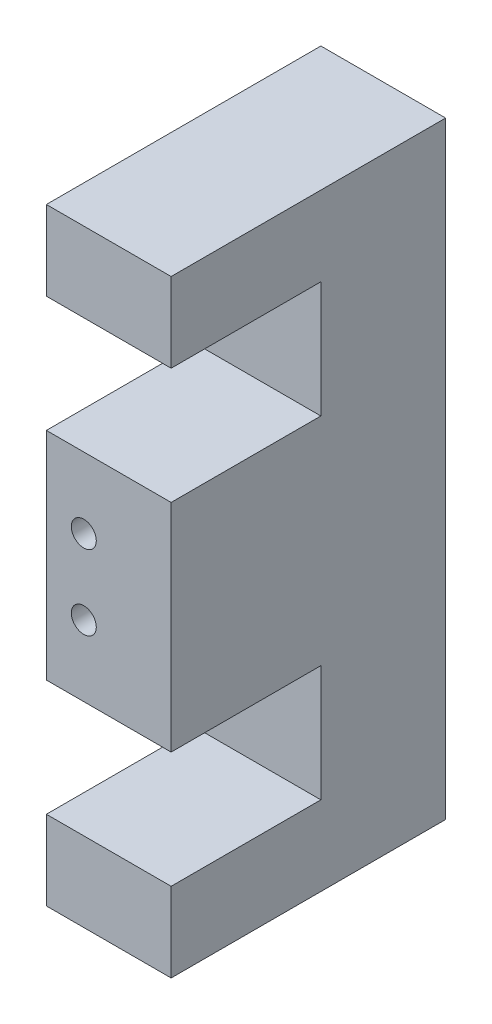
ISO-10303-21;
HEADER;
FILE_DESCRIPTION(('STEP AP214'),'2;1');
FILE_NAME('part.step','',(''),(''),'','','');
FILE_SCHEMA(('AUTOMOTIVE_DESIGN { 1 0 10303 214 1 1 1 1 }'));
ENDSEC;
DATA;
#1=APPLICATION_CONTEXT('core data for automotive mechanical design processes');
#2=APPLICATION_PROTOCOL_DEFINITION('international standard','automotive_design',2000,#1);
#3=PRODUCT_CONTEXT('',#1,'mechanical');
#4=PRODUCT('Part','Part','',(#3));
#5=PRODUCT_RELATED_PRODUCT_CATEGORY('part','',(#4));
#6=PRODUCT_DEFINITION_FORMATION('','',#4);
#7=PRODUCT_DEFINITION_CONTEXT('part definition',#1,'design');
#8=PRODUCT_DEFINITION('design','',#6,#7);
#9=PRODUCT_DEFINITION_SHAPE('','',#8);
#10=(LENGTH_UNIT() NAMED_UNIT(*) SI_UNIT(.MILLI.,.METRE.));
#11=(NAMED_UNIT(*) PLANE_ANGLE_UNIT() SI_UNIT($,.RADIAN.));
#12=(NAMED_UNIT(*) SI_UNIT($,.STERADIAN.) SOLID_ANGLE_UNIT());
#13=UNCERTAINTY_MEASURE_WITH_UNIT(LENGTH_MEASURE(1.E-05),#10,'distance_accuracy_value','');
#14=(GEOMETRIC_REPRESENTATION_CONTEXT(3) GLOBAL_UNCERTAINTY_ASSIGNED_CONTEXT((#13)) GLOBAL_UNIT_ASSIGNED_CONTEXT((#10,
#11,#12)) REPRESENTATION_CONTEXT('',''));
#15=CARTESIAN_POINT('',(0.,0.,0.));
#16=DIRECTION('',(0.,0.,1.));
#17=DIRECTION('',(1.,0.,0.));
#18=AXIS2_PLACEMENT_3D('',#15,#16,#17);
#19=CARTESIAN_POINT('',(0.,0.,-3.99999999999999));
#20=DIRECTION('',(0.,0.,1.));
#21=DIRECTION('',(1.,0.,0.));
#22=AXIS2_PLACEMENT_3D('',#19,#20,#21);
#23=PLANE('',#22);
#24=DIRECTION('',(1.,0.,0.));
#25=VECTOR('',#24,1.);
#26=CARTESIAN_POINT('',(0.,-39.7528650201413,-4.));
#27=LINE('',#26,#25);
#28=CARTESIAN_POINT('',(22.1000000000024,-39.7528650201413,-4.));
#29=VERTEX_POINT('',#28);
#30=CARTESIAN_POINT('',(34.8000000000024,-39.7528650201413,-4.));
#31=VERTEX_POINT('',#30);
#32=EDGE_CURVE('E50',#29,#31,#27,.T.);
#33=ORIENTED_EDGE('',*,*,#32,.T.);
#34=DIRECTION('',(0.,-1.,0.));
#35=VECTOR('',#34,1.);
#36=CARTESIAN_POINT('',(34.8000000000024,0.,-4.));
#37=LINE('',#36,#35);
#38=CARTESIAN_POINT('',(34.8000000000024,-27.923752716534,-4.));
#39=VERTEX_POINT('',#38);
#40=EDGE_CURVE('E216',#39,#31,#37,.T.);
#41=ORIENTED_EDGE('',*,*,#40,.F.);
#42=DIRECTION('',(1.,0.,0.));
#43=VECTOR('',#42,1.);
#44=CARTESIAN_POINT('',(0.,-27.923752716534,-4.));
#45=LINE('',#44,#43);
#46=CARTESIAN_POINT('',(22.1000000000024,-27.923752716534,-4.));
#47=VERTEX_POINT('',#46);
#48=EDGE_CURVE('E165',#47,#39,#45,.T.);
#49=ORIENTED_EDGE('',*,*,#48,.F.);
#50=DIRECTION('',(0.,-1.,0.));
#51=VECTOR('',#50,1.);
#52=CARTESIAN_POINT('',(22.1000000000024,0.,-4.));
#53=LINE('',#52,#51);
#54=EDGE_CURVE('E55',#47,#29,#53,.T.);
#55=ORIENTED_EDGE('',*,*,#54,.T.);
#56=EDGE_LOOP('',(#33,#41,#49,#55));
#57=FACE_BOUND('',#56,.T.);
#58=ADVANCED_FACE('F33',(#57),#23,.T.);
#59=DIRECTION('',(1.,0.,0.));
#60=VECTOR('',#59,1.);
#61=CARTESIAN_POINT('',(0.,-5.91455615180365,-3.99999999999999));
#62=LINE('',#61,#60);
#63=CARTESIAN_POINT('',(22.1000000000024,-5.91455615180365,-4.));
#64=VERTEX_POINT('',#63);
#65=CARTESIAN_POINT('',(34.8000000000024,-5.91455615180365,-4.));
#66=VERTEX_POINT('',#65);
#67=EDGE_CURVE('E159',#64,#66,#62,.T.);
#68=ORIENTED_EDGE('',*,*,#67,.T.);
#69=CARTESIAN_POINT('',(34.8000000000024,5.91455615180364,-4.));
#70=VERTEX_POINT('',#69);
#71=EDGE_CURVE('E208',#70,#66,#37,.T.);
#72=ORIENTED_EDGE('',*,*,#71,.F.);
#73=DIRECTION('',(-1.,0.,0.));
#74=VECTOR('',#73,1.);
#75=CARTESIAN_POINT('',(0.,5.91455615180365,-3.99999999999999));
#76=LINE('',#75,#74);
#77=CARTESIAN_POINT('',(22.1000000000024,5.91455615180364,-4.));
#78=VERTEX_POINT('',#77);
#79=EDGE_CURVE('E179',#70,#78,#76,.T.);
#80=ORIENTED_EDGE('',*,*,#79,.T.);
#81=EDGE_CURVE('E214',#78,#64,#53,.T.);
#82=ORIENTED_EDGE('',*,*,#81,.T.);
#83=EDGE_LOOP('',(#68,#72,#80,#82));
#84=FACE_BOUND('',#83,.T.);
#85=ADVANCED_FACE('F241',(#84),#23,.T.);
#86=CARTESIAN_POINT('',(52.8000000000024,14.,-16.7));
#87=DIRECTION('',(0.,1.,0.));
#88=DIRECTION('',(0.,0.,1.));
#89=AXIS2_PLACEMENT_3D('',#86,#87,#88);
#90=PLANE('',#89);
#91=DIRECTION('',(0.,0.,1.));
#92=VECTOR('',#91,1.);
#93=CARTESIAN_POINT('',(22.1000000000024,14.,-16.7));
#94=LINE('',#93,#92);
#95=CARTESIAN_POINT('',(22.1000000000024,14.,-16.7));
#96=VERTEX_POINT('',#95);
#97=CARTESIAN_POINT('',(22.1000000000024,14.,11.24));
#98=VERTEX_POINT('',#97);
#99=EDGE_CURVE('E37',#96,#98,#94,.T.);
#100=ORIENTED_EDGE('',*,*,#99,.T.);
#101=DIRECTION('',(-1.,0.,0.));
#102=VECTOR('',#101,1.);
#103=CARTESIAN_POINT('',(0.,14.,11.24));
#104=LINE('',#103,#102);
#105=CARTESIAN_POINT('',(34.8000000000024,14.,11.24));
#106=VERTEX_POINT('',#105);
#107=EDGE_CURVE('E196',#106,#98,#104,.T.);
#108=ORIENTED_EDGE('',*,*,#107,.F.);
#109=DIRECTION('',(0.,0.,1.));
#110=VECTOR('',#109,1.);
#111=CARTESIAN_POINT('',(34.8000000000024,14.,-16.7));
#112=LINE('',#111,#110);
#113=CARTESIAN_POINT('',(34.8000000000024,14.,-16.7));
#114=VERTEX_POINT('',#113);
#115=EDGE_CURVE('E11',#114,#106,#112,.T.);
#116=ORIENTED_EDGE('',*,*,#115,.F.);
#117=DIRECTION('',(-1.,0.,0.));
#118=VECTOR('',#117,1.);
#119=CARTESIAN_POINT('',(52.8000000000024,14.,-16.7));
#120=LINE('',#119,#118);
#121=EDGE_CURVE('E205',#114,#96,#120,.T.);
#122=ORIENTED_EDGE('',*,*,#121,.T.);
#123=EDGE_LOOP('',(#100,#108,#116,#122));
#124=FACE_BOUND('',#123,.T.);
#125=ADVANCED_FACE('F35',(#124),#90,.T.);
#126=CARTESIAN_POINT('',(34.8000000000024,0.,-16.7));
#127=DIRECTION('',(-1.,0.,0.));
#128=DIRECTION('',(0.,-1.,0.));
#129=AXIS2_PLACEMENT_3D('',#126,#127,#128);
#130=PLANE('',#129);
#131=ORIENTED_EDGE('',*,*,#115,.T.);
#132=DIRECTION('',(0.,-1.,0.));
#133=VECTOR('',#132,1.);
#134=CARTESIAN_POINT('',(34.8000000000024,0.,11.24));
#135=LINE('',#134,#133);
#136=CARTESIAN_POINT('',(34.8000000000024,5.91455615180364,11.24));
#137=VERTEX_POINT('',#136);
#138=EDGE_CURVE('E188',#106,#137,#135,.T.);
#139=ORIENTED_EDGE('',*,*,#138,.T.);
#140=DIRECTION('',(0.,0.,-1.));
#141=VECTOR('',#140,1.);
#142=CARTESIAN_POINT('',(34.8000000000024,5.91455615180364,11.24));
#143=LINE('',#142,#141);
#144=EDGE_CURVE('E199',#137,#70,#143,.T.);
#145=ORIENTED_EDGE('',*,*,#144,.T.);
#146=ORIENTED_EDGE('',*,*,#71,.T.);
#147=DIRECTION('',(0.,0.,-1.));
#148=VECTOR('',#147,1.);
#149=CARTESIAN_POINT('',(34.8000000000024,-5.91455615180366,11.24));
#150=LINE('',#149,#148);
#151=CARTESIAN_POINT('',(34.8000000000024,-5.91455615180366,11.24));
#152=VERTEX_POINT('',#151);
#153=EDGE_CURVE('E172',#152,#66,#150,.T.);
#154=ORIENTED_EDGE('',*,*,#153,.F.);
#155=DIRECTION('',(0.,-1.,0.));
#156=VECTOR('',#155,1.);
#157=CARTESIAN_POINT('',(34.8000000000024,0.,11.24));
#158=LINE('',#157,#156);
#159=CARTESIAN_POINT('',(34.8000000000024,-27.923752716534,11.24));
#160=VERTEX_POINT('',#159);
#161=EDGE_CURVE('E164',#152,#160,#158,.T.);
#162=ORIENTED_EDGE('',*,*,#161,.T.);
#163=DIRECTION('',(0.,0.,-1.));
#164=VECTOR('',#163,1.);
#165=CARTESIAN_POINT('',(34.8000000000024,-27.923752716534,11.24));
#166=LINE('',#165,#164);
#167=EDGE_CURVE('E183',#160,#39,#166,.T.);
#168=ORIENTED_EDGE('',*,*,#167,.T.);
#169=ORIENTED_EDGE('',*,*,#40,.T.);
#170=DIRECTION('',(0.,0.,-1.));
#171=VECTOR('',#170,1.);
#172=CARTESIAN_POINT('',(34.8000000000024,-39.7528650201413,11.24));
#173=LINE('',#172,#171);
#174=CARTESIAN_POINT('',(34.8000000000024,-39.7528650201413,11.24));
#175=VERTEX_POINT('',#174);
#176=EDGE_CURVE('E156',#175,#31,#173,.T.);
#177=ORIENTED_EDGE('',*,*,#176,.F.);
#178=DIRECTION('',(0.,-1.,0.));
#179=VECTOR('',#178,1.);
#180=CARTESIAN_POINT('',(34.8000000000024,0.,11.24));
#181=LINE('',#180,#179);
#182=CARTESIAN_POINT('',(34.8000000000024,-47.8383088683376,11.24));
#183=VERTEX_POINT('',#182);
#184=EDGE_CURVE('E153',#175,#183,#181,.T.);
#185=ORIENTED_EDGE('',*,*,#184,.T.);
#186=DIRECTION('',(0.,0.,1.));
#187=VECTOR('',#186,1.);
#188=CARTESIAN_POINT('',(34.8000000000024,-47.8383088683376,-16.7));
#189=LINE('',#188,#187);
#190=CARTESIAN_POINT('',(34.8000000000024,-47.8383088683376,-16.7));
#191=VERTEX_POINT('',#190);
#192=EDGE_CURVE('E42',#191,#183,#189,.T.);
#193=ORIENTED_EDGE('',*,*,#192,.F.);
#194=DIRECTION('',(0.,-1.,0.));
#195=VECTOR('',#194,1.);
#196=CARTESIAN_POINT('',(34.8000000000024,0.,-16.7));
#197=LINE('',#196,#195);
#198=EDGE_CURVE('E212',#114,#191,#197,.T.);
#199=ORIENTED_EDGE('',*,*,#198,.F.);
#200=EDGE_LOOP('',(#131,#139,#145,#146,#154,#162,#168,#169,#177,#185,#193,#199));
#201=FACE_BOUND('',#200,.T.);
#202=ADVANCED_FACE('F221',(#201),#130,.F.);
#203=CARTESIAN_POINT('',(52.8000000000024,-47.8383088683376,-16.7));
#204=DIRECTION('',(0.,1.,0.));
#205=DIRECTION('',(0.,0.,1.));
#206=AXIS2_PLACEMENT_3D('',#203,#204,#205);
#207=PLANE('',#206);
#208=ORIENTED_EDGE('',*,*,#192,.T.);
#209=DIRECTION('',(-1.,0.,0.));
#210=VECTOR('',#209,1.);
#211=CARTESIAN_POINT('',(0.,-47.8383088683376,11.24));
#212=LINE('',#211,#210);
#213=CARTESIAN_POINT('',(22.1000000000024,-47.8383088683376,11.24));
#214=VERTEX_POINT('',#213);
#215=EDGE_CURVE('E138',#183,#214,#212,.T.);
#216=ORIENTED_EDGE('',*,*,#215,.T.);
#217=DIRECTION('',(0.,0.,1.));
#218=VECTOR('',#217,1.);
#219=CARTESIAN_POINT('',(22.1000000000024,-47.8383088683376,-16.7));
#220=LINE('',#219,#218);
#221=CARTESIAN_POINT('',(22.1000000000024,-47.8383088683376,-16.7));
#222=VERTEX_POINT('',#221);
#223=EDGE_CURVE('E123',#222,#214,#220,.T.);
#224=ORIENTED_EDGE('',*,*,#223,.F.);
#225=DIRECTION('',(-1.,0.,0.));
#226=VECTOR('',#225,1.);
#227=CARTESIAN_POINT('',(52.8000000000024,-47.8383088683376,-16.7));
#228=LINE('',#227,#226);
#229=EDGE_CURVE('E210',#191,#222,#228,.T.);
#230=ORIENTED_EDGE('',*,*,#229,.F.);
#231=EDGE_LOOP('',(#208,#216,#224,#230));
#232=FACE_BOUND('',#231,.T.);
#233=ADVANCED_FACE('F143',(#232),#207,.F.);
#234=CARTESIAN_POINT('',(22.1000000000024,0.,-16.7));
#235=DIRECTION('',(-1.,0.,0.));
#236=DIRECTION('',(0.,0.,1.));
#237=AXIS2_PLACEMENT_3D('',#234,#235,#236);
#238=PLANE('',#237);
#239=ORIENTED_EDGE('',*,*,#81,.F.);
#240=DIRECTION('',(0.,0.,-1.));
#241=VECTOR('',#240,1.);
#242=CARTESIAN_POINT('',(22.1000000000024,5.91455615180364,11.24));
#243=LINE('',#242,#241);
#244=CARTESIAN_POINT('',(22.1000000000024,5.91455615180364,11.24));
#245=VERTEX_POINT('',#244);
#246=EDGE_CURVE('E202',#245,#78,#243,.T.);
#247=ORIENTED_EDGE('',*,*,#246,.F.);
#248=DIRECTION('',(0.,-1.,0.));
#249=VECTOR('',#248,1.);
#250=CARTESIAN_POINT('',(22.1000000000024,0.,11.24));
#251=LINE('',#250,#249);
#252=EDGE_CURVE('E194',#98,#245,#251,.T.);
#253=ORIENTED_EDGE('',*,*,#252,.F.);
#254=ORIENTED_EDGE('',*,*,#99,.F.);
#255=DIRECTION('',(0.,-1.,0.));
#256=VECTOR('',#255,1.);
#257=CARTESIAN_POINT('',(22.1000000000024,0.,-16.7));
#258=LINE('',#257,#256);
#259=EDGE_CURVE('E130',#96,#222,#258,.T.);
#260=ORIENTED_EDGE('',*,*,#259,.T.);
#261=ORIENTED_EDGE('',*,*,#223,.T.);
#262=DIRECTION('',(0.,-1.,0.));
#263=VECTOR('',#262,1.);
#264=CARTESIAN_POINT('',(22.1000000000024,0.,11.24));
#265=LINE('',#264,#263);
#266=CARTESIAN_POINT('',(22.1000000000024,-39.7528650201413,11.24));
#267=VERTEX_POINT('',#266);
#268=EDGE_CURVE('E127',#267,#214,#265,.T.);
#269=ORIENTED_EDGE('',*,*,#268,.F.);
#270=DIRECTION('',(0.,0.,-1.));
#271=VECTOR('',#270,1.);
#272=CARTESIAN_POINT('',(22.1000000000024,-39.7528650201413,11.24));
#273=LINE('',#272,#271);
#274=EDGE_CURVE('E154',#267,#29,#273,.T.);
#275=ORIENTED_EDGE('',*,*,#274,.T.);
#276=ORIENTED_EDGE('',*,*,#54,.F.);
#277=DIRECTION('',(0.,0.,-1.));
#278=VECTOR('',#277,1.);
#279=CARTESIAN_POINT('',(22.1000000000024,-27.923752716534,11.24));
#280=LINE('',#279,#278);
#281=CARTESIAN_POINT('',(22.1000000000024,-27.923752716534,11.24));
#282=VERTEX_POINT('',#281);
#283=EDGE_CURVE('E180',#282,#47,#280,.T.);
#284=ORIENTED_EDGE('',*,*,#283,.F.);
#285=DIRECTION('',(0.,-1.,0.));
#286=VECTOR('',#285,1.);
#287=CARTESIAN_POINT('',(22.1000000000024,0.,11.24));
#288=LINE('',#287,#286);
#289=CARTESIAN_POINT('',(22.1000000000024,-5.91455615180365,11.24));
#290=VERTEX_POINT('',#289);
#291=EDGE_CURVE('E170',#290,#282,#288,.T.);
#292=ORIENTED_EDGE('',*,*,#291,.F.);
#293=DIRECTION('',(0.,0.,-1.));
#294=VECTOR('',#293,1.);
#295=CARTESIAN_POINT('',(22.1000000000024,-5.91455615180365,11.24));
#296=LINE('',#295,#294);
#297=EDGE_CURVE('E176',#290,#64,#296,.T.);
#298=ORIENTED_EDGE('',*,*,#297,.T.);
#299=EDGE_LOOP('',(#239,#247,#253,#254,#260,#261,#269,#275,#276,#284,#292,#298));
#300=FACE_BOUND('',#299,.T.);
#301=ADVANCED_FACE('F126',(#300),#238,.T.);
#302=CARTESIAN_POINT('',(0.,0.,-16.7));
#303=DIRECTION('',(0.,0.,1.));
#304=DIRECTION('',(1.,0.,0.));
#305=AXIS2_PLACEMENT_3D('',#302,#303,#304);
#306=PLANE('',#305);
#307=CARTESIAN_POINT('',(25.9100000000024,-13.1091544341688,-16.7));
#308=DIRECTION('',(0.,0.,-1.));
#309=DIRECTION('',(-1.,0.,0.));
#310=AXIS2_PLACEMENT_3D('',#307,#308,#309);
#311=CIRCLE('',#310,1.27);
#312=CARTESIAN_POINT('',(24.6400000000024,-13.1091544341688,-16.7));
#313=VERTEX_POINT('',#312);
#314=EDGE_CURVE('E276',#313,#313,#311,.T.);
#315=ORIENTED_EDGE('',*,*,#314,.F.);
#316=EDGE_LOOP('',(#315));
#317=FACE_BOUND('',#316,.T.);
#318=CARTESIAN_POINT('',(25.9100000000024,-20.7291544341688,-16.7));
#319=DIRECTION('',(0.,0.,-1.));
#320=DIRECTION('',(-1.,0.,0.));
#321=AXIS2_PLACEMENT_3D('',#318,#319,#320);
#322=CIRCLE('',#321,1.27);
#323=CARTESIAN_POINT('',(24.6400000000024,-20.7291544341688,-16.7));
#324=VERTEX_POINT('',#323);
#325=EDGE_CURVE('E280',#324,#324,#322,.T.);
#326=ORIENTED_EDGE('',*,*,#325,.F.);
#327=EDGE_LOOP('',(#326));
#328=FACE_BOUND('',#327,.T.);
#329=CARTESIAN_POINT('',(29.7200000000024,-16.9191544341688,-16.6999999999999));
#330=DIRECTION('',(0.,0.,-1.));
#331=DIRECTION('',(-1.,0.,0.));
#332=AXIS2_PLACEMENT_3D('',#329,#330,#331);
#333=CIRCLE('',#332,1.778);
#334=CARTESIAN_POINT('',(27.9420000000024,-16.9191544341688,-16.6999999999999));
#335=VERTEX_POINT('',#334);
#336=EDGE_CURVE('E149',#335,#335,#333,.T.);
#337=ORIENTED_EDGE('',*,*,#336,.F.);
#338=EDGE_LOOP('',(#337));
#339=FACE_BOUND('',#338,.T.);
#340=ORIENTED_EDGE('',*,*,#121,.F.);
#341=ORIENTED_EDGE('',*,*,#198,.T.);
#342=ORIENTED_EDGE('',*,*,#229,.T.);
#343=ORIENTED_EDGE('',*,*,#259,.F.);
#344=EDGE_LOOP('',(#340,#341,#342,#343));
#345=FACE_BOUND('',#344,.T.);
#346=ADVANCED_FACE('F228',(#317,#328,#339,#345),#306,.F.);
#347=CARTESIAN_POINT('',(0.,5.91455615180365,11.24));
#348=DIRECTION('',(0.,-1.,0.));
#349=DIRECTION('',(1.,0.,0.));
#350=AXIS2_PLACEMENT_3D('',#347,#348,#349);
#351=PLANE('',#350);
#352=ORIENTED_EDGE('',*,*,#79,.F.);
#353=ORIENTED_EDGE('',*,*,#144,.F.);
#354=DIRECTION('',(-1.,0.,0.));
#355=VECTOR('',#354,1.);
#356=CARTESIAN_POINT('',(0.,5.91455615180365,11.24));
#357=LINE('',#356,#355);
#358=EDGE_CURVE('E191',#137,#245,#357,.T.);
#359=ORIENTED_EDGE('',*,*,#358,.T.);
#360=ORIENTED_EDGE('',*,*,#246,.T.);
#361=EDGE_LOOP('',(#352,#353,#359,#360));
#362=FACE_BOUND('',#361,.T.);
#363=ADVANCED_FACE('F239',(#362),#351,.T.);
#364=CARTESIAN_POINT('',(0.,0.,11.24));
#365=DIRECTION('',(0.,0.,-1.));
#366=DIRECTION('',(-1.,0.,0.));
#367=AXIS2_PLACEMENT_3D('',#364,#365,#366);
#368=PLANE('',#367);
#369=ORIENTED_EDGE('',*,*,#138,.F.);
#370=ORIENTED_EDGE('',*,*,#107,.T.);
#371=ORIENTED_EDGE('',*,*,#252,.T.);
#372=ORIENTED_EDGE('',*,*,#358,.F.);
#373=EDGE_LOOP('',(#369,#370,#371,#372));
#374=FACE_BOUND('',#373,.T.);
#375=ADVANCED_FACE('F235',(#374),#368,.F.);
#376=CARTESIAN_POINT('',(0.,-5.91455615180365,11.24));
#377=DIRECTION('',(0.,1.,0.));
#378=DIRECTION('',(-1.,0.,0.));
#379=AXIS2_PLACEMENT_3D('',#376,#377,#378);
#380=PLANE('',#379);
#381=ORIENTED_EDGE('',*,*,#67,.F.);
#382=ORIENTED_EDGE('',*,*,#297,.F.);
#383=DIRECTION('',(1.,0.,0.));
#384=VECTOR('',#383,1.);
#385=CARTESIAN_POINT('',(0.,-5.91455615180365,11.24));
#386=LINE('',#385,#384);
#387=EDGE_CURVE('E161',#290,#152,#386,.T.);
#388=ORIENTED_EDGE('',*,*,#387,.T.);
#389=ORIENTED_EDGE('',*,*,#153,.T.);
#390=EDGE_LOOP('',(#381,#382,#388,#389));
#391=FACE_BOUND('',#390,.T.);
#392=ADVANCED_FACE('F244',(#391),#380,.T.);
#393=CARTESIAN_POINT('',(0.,-27.923752716534,11.24));
#394=DIRECTION('',(0.,1.,0.));
#395=DIRECTION('',(-1.,0.,0.));
#396=AXIS2_PLACEMENT_3D('',#393,#394,#395);
#397=PLANE('',#396);
#398=ORIENTED_EDGE('',*,*,#48,.T.);
#399=ORIENTED_EDGE('',*,*,#167,.F.);
#400=DIRECTION('',(1.,0.,0.));
#401=VECTOR('',#400,1.);
#402=CARTESIAN_POINT('',(0.,-27.923752716534,11.24));
#403=LINE('',#402,#401);
#404=EDGE_CURVE('E168',#282,#160,#403,.T.);
#405=ORIENTED_EDGE('',*,*,#404,.F.);
#406=ORIENTED_EDGE('',*,*,#283,.T.);
#407=EDGE_LOOP('',(#398,#399,#405,#406));
#408=FACE_BOUND('',#407,.T.);
#409=ADVANCED_FACE('F253',(#408),#397,.F.);
#410=CARTESIAN_POINT('',(0.,0.,11.24));
#411=DIRECTION('',(0.,0.,-1.));
#412=DIRECTION('',(-1.,0.,0.));
#413=AXIS2_PLACEMENT_3D('',#410,#411,#412);
#414=PLANE('',#413);
#415=CARTESIAN_POINT('',(25.9100000000024,-13.1091544341688,11.24));
#416=DIRECTION('',(0.,0.,-1.));
#417=DIRECTION('',(-1.,0.,0.));
#418=AXIS2_PLACEMENT_3D('',#415,#416,#417);
#419=CIRCLE('',#418,1.27);
#420=CARTESIAN_POINT('',(24.6400000000024,-13.1091544341688,11.24));
#421=VERTEX_POINT('',#420);
#422=EDGE_CURVE('E284',#421,#421,#419,.T.);
#423=ORIENTED_EDGE('',*,*,#422,.T.);
#424=EDGE_LOOP('',(#423));
#425=FACE_BOUND('',#424,.T.);
#426=CARTESIAN_POINT('',(25.9100000000024,-20.7291544341688,11.24));
#427=DIRECTION('',(0.,0.,-1.));
#428=DIRECTION('',(-1.,0.,0.));
#429=AXIS2_PLACEMENT_3D('',#426,#427,#428);
#430=CIRCLE('',#429,1.27);
#431=CARTESIAN_POINT('',(24.6400000000024,-20.7291544341688,11.24));
#432=VERTEX_POINT('',#431);
#433=EDGE_CURVE('E293',#432,#432,#430,.T.);
#434=ORIENTED_EDGE('',*,*,#433,.T.);
#435=EDGE_LOOP('',(#434));
#436=FACE_BOUND('',#435,.T.);
#437=ORIENTED_EDGE('',*,*,#387,.F.);
#438=ORIENTED_EDGE('',*,*,#291,.T.);
#439=ORIENTED_EDGE('',*,*,#404,.T.);
#440=ORIENTED_EDGE('',*,*,#161,.F.);
#441=EDGE_LOOP('',(#437,#438,#439,#440));
#442=FACE_BOUND('',#441,.T.);
#443=ADVANCED_FACE('F249',(#425,#436,#442),#414,.F.);
#444=CARTESIAN_POINT('',(0.,-39.7528650201413,11.24));
#445=DIRECTION('',(0.,1.,0.));
#446=DIRECTION('',(0.,0.,1.));
#447=AXIS2_PLACEMENT_3D('',#444,#445,#446);
#448=PLANE('',#447);
#449=ORIENTED_EDGE('',*,*,#32,.F.);
#450=ORIENTED_EDGE('',*,*,#274,.F.);
#451=DIRECTION('',(1.,0.,0.));
#452=VECTOR('',#451,1.);
#453=CARTESIAN_POINT('',(0.,-39.7528650201413,11.24));
#454=LINE('',#453,#452);
#455=EDGE_CURVE('E141',#267,#175,#454,.T.);
#456=ORIENTED_EDGE('',*,*,#455,.T.);
#457=ORIENTED_EDGE('',*,*,#176,.T.);
#458=EDGE_LOOP('',(#449,#450,#456,#457));
#459=FACE_BOUND('',#458,.T.);
#460=ADVANCED_FACE('F224',(#459),#448,.T.);
#461=CARTESIAN_POINT('',(0.,0.,11.24));
#462=DIRECTION('',(0.,0.,1.));
#463=DIRECTION('',(1.,0.,0.));
#464=AXIS2_PLACEMENT_3D('',#461,#462,#463);
#465=PLANE('',#464);
#466=ORIENTED_EDGE('',*,*,#215,.F.);
#467=ORIENTED_EDGE('',*,*,#184,.F.);
#468=ORIENTED_EDGE('',*,*,#455,.F.);
#469=ORIENTED_EDGE('',*,*,#268,.T.);
#470=EDGE_LOOP('',(#466,#467,#468,#469));
#471=FACE_BOUND('',#470,.T.);
#472=ADVANCED_FACE('F136',(#471),#465,.T.);
#473=CARTESIAN_POINT('',(29.7200000000024,-16.9191544341688,-9.07999999999993));
#474=DIRECTION('',(0.,0.,-1.));
#475=DIRECTION('',(-1.,0.,0.));
#476=AXIS2_PLACEMENT_3D('',#473,#474,#475);
#477=CYLINDRICAL_SURFACE('',#476,1.778);
#478=CARTESIAN_POINT('',(29.7200000000024,-16.9191544341688,-9.07999999999993));
#479=DIRECTION('',(0.,0.,-1.));
#480=DIRECTION('',(-1.,0.,0.));
#481=AXIS2_PLACEMENT_3D('',#478,#479,#480);
#482=CIRCLE('',#481,1.778);
#483=CARTESIAN_POINT('',(27.9420000000024,-16.9191544341688,-9.07999999999993));
#484=VERTEX_POINT('',#483);
#485=EDGE_CURVE('E146',#484,#484,#482,.T.);
#486=CARTESIAN_POINT('',(27.9420000000024,-16.9191544341688,-9.07999999999993));
#487=CARTESIAN_POINT('',(27.9420000000024,-16.9191544341688,-9.15937499999993));
#488=CARTESIAN_POINT('',(27.9420000000024,-16.9191544341688,-9.23874999999993));
#489=CARTESIAN_POINT('',(27.9420000000024,-16.9191544341688,-9.39749999999993));
#490=CARTESIAN_POINT('',(27.9420000000024,-16.9191544341688,-9.47687499999993));
#491=CARTESIAN_POINT('',(27.9420000000024,-16.9191544341688,-9.63562499999993));
#492=CARTESIAN_POINT('',(27.9420000000024,-16.9191544341688,-9.71499999999993));
#493=CARTESIAN_POINT('',(27.9420000000024,-16.9191544341688,-9.87374999999993));
#494=CARTESIAN_POINT('',(27.9420000000024,-16.9191544341688,-9.95312499999993));
#495=CARTESIAN_POINT('',(27.9420000000024,-16.9191544341688,-10.1118749999999));
#496=CARTESIAN_POINT('',(27.9420000000024,-16.9191544341688,-10.1912499999999));
#497=CARTESIAN_POINT('',(27.9420000000024,-16.9191544341688,-10.3499999999999));
#498=CARTESIAN_POINT('',(27.9420000000024,-16.9191544341688,-10.4293749999999));
#499=CARTESIAN_POINT('',(27.9420000000024,-16.9191544341688,-10.5881249999999));
#500=CARTESIAN_POINT('',(27.9420000000024,-16.9191544341688,-10.6674999999999));
#501=CARTESIAN_POINT('',(27.9420000000024,-16.9191544341688,-10.8262499999999));
#502=CARTESIAN_POINT('',(27.9420000000024,-16.9191544341688,-10.9056249999999));
#503=CARTESIAN_POINT('',(27.9420000000024,-16.9191544341688,-11.0643749999999));
#504=CARTESIAN_POINT('',(27.9420000000024,-16.9191544341688,-11.1437499999999));
#505=CARTESIAN_POINT('',(27.9420000000024,-16.9191544341688,-11.3024999999999));
#506=CARTESIAN_POINT('',(27.9420000000024,-16.9191544341688,-11.3818749999999));
#507=CARTESIAN_POINT('',(27.9420000000024,-16.9191544341688,-11.5406249999999));
#508=CARTESIAN_POINT('',(27.9420000000024,-16.9191544341688,-11.6199999999999));
#509=CARTESIAN_POINT('',(27.9420000000024,-16.9191544341688,-11.7787499999999));
#510=CARTESIAN_POINT('',(27.9420000000024,-16.9191544341688,-11.8581249999999));
#511=CARTESIAN_POINT('',(27.9420000000024,-16.9191544341688,-12.0168749999999));
#512=CARTESIAN_POINT('',(27.9420000000024,-16.9191544341688,-12.0962499999999));
#513=CARTESIAN_POINT('',(27.9420000000024,-16.9191544341688,-12.2549999999999));
#514=CARTESIAN_POINT('',(27.9420000000024,-16.9191544341688,-12.3343749999999));
#515=CARTESIAN_POINT('',(27.9420000000024,-16.9191544341688,-12.4931249999999));
#516=CARTESIAN_POINT('',(27.9420000000024,-16.9191544341688,-12.5724999999999));
#517=CARTESIAN_POINT('',(27.9420000000024,-16.9191544341688,-12.7312499999999));
#518=CARTESIAN_POINT('',(27.9420000000024,-16.9191544341688,-12.8106249999999));
#519=CARTESIAN_POINT('',(27.9420000000024,-16.9191544341688,-12.9693749999999));
#520=CARTESIAN_POINT('',(27.9420000000024,-16.9191544341688,-13.0487499999999));
#521=CARTESIAN_POINT('',(27.9420000000024,-16.9191544341688,-13.2074999999999));
#522=CARTESIAN_POINT('',(27.9420000000024,-16.9191544341688,-13.2868749999999));
#523=CARTESIAN_POINT('',(27.9420000000024,-16.9191544341688,-13.4456249999999));
#524=CARTESIAN_POINT('',(27.9420000000024,-16.9191544341688,-13.5249999999999));
#525=CARTESIAN_POINT('',(27.9420000000024,-16.9191544341688,-13.6837499999999));
#526=CARTESIAN_POINT('',(27.9420000000024,-16.9191544341688,-13.7631249999999));
#527=CARTESIAN_POINT('',(27.9420000000024,-16.9191544341688,-13.9218749999999));
#528=CARTESIAN_POINT('',(27.9420000000024,-16.9191544341688,-14.0012499999999));
#529=CARTESIAN_POINT('',(27.9420000000024,-16.9191544341688,-14.1599999999999));
#530=CARTESIAN_POINT('',(27.9420000000024,-16.9191544341688,-14.2393749999999));
#531=CARTESIAN_POINT('',(27.9420000000024,-16.9191544341688,-14.3981249999999));
#532=CARTESIAN_POINT('',(27.9420000000024,-16.9191544341688,-14.4774999999999));
#533=CARTESIAN_POINT('',(27.9420000000024,-16.9191544341688,-14.6362499999999));
#534=CARTESIAN_POINT('',(27.9420000000024,-16.9191544341688,-14.7156249999999));
#535=CARTESIAN_POINT('',(27.9420000000024,-16.9191544341688,-14.8743749999999));
#536=CARTESIAN_POINT('',(27.9420000000024,-16.9191544341688,-14.9537499999999));
#537=CARTESIAN_POINT('',(27.9420000000024,-16.9191544341688,-15.1124999999999));
#538=CARTESIAN_POINT('',(27.9420000000024,-16.9191544341688,-15.1918749999999));
#539=CARTESIAN_POINT('',(27.9420000000024,-16.9191544341688,-15.3506249999999));
#540=CARTESIAN_POINT('',(27.9420000000024,-16.9191544341688,-15.4299999999999));
#541=CARTESIAN_POINT('',(27.9420000000024,-16.9191544341688,-15.5887499999999));
#542=CARTESIAN_POINT('',(27.9420000000024,-16.9191544341688,-15.6681249999999));
#543=CARTESIAN_POINT('',(27.9420000000024,-16.9191544341688,-15.8268749999999));
#544=CARTESIAN_POINT('',(27.9420000000024,-16.9191544341688,-15.9062499999999));
#545=CARTESIAN_POINT('',(27.9420000000024,-16.9191544341688,-16.0649999999999));
#546=CARTESIAN_POINT('',(27.9420000000024,-16.9191544341688,-16.1443749999999));
#547=CARTESIAN_POINT('',(27.9420000000024,-16.9191544341688,-16.3031249999999));
#548=CARTESIAN_POINT('',(27.9420000000024,-16.9191544341688,-16.3824999999999));
#549=CARTESIAN_POINT('',(27.9420000000024,-16.9191544341688,-16.5412499999999));
#550=CARTESIAN_POINT('',(27.9420000000024,-16.9191544341688,-16.6206249999999));
#551=CARTESIAN_POINT('',(27.9420000000024,-16.9191544341688,-16.6999999999999));
#552=B_SPLINE_CURVE_WITH_KNOTS('',3,(#486,#487,#488,#489,#490,#491,#492,#493,#494,#495,#496,
#497,#498,#499,#500,#501,#502,#503,#504,#505,#506,#507,#508,#509,#510,#511,#512,#513,#514,#515,
#516,#517,#518,#519,#520,#521,#522,#523,#524,#525,#526,#527,#528,#529,#530,#531,#532,#533,#534,
#535,#536,#537,#538,#539,#540,#541,#542,#543,#544,#545,#546,#547,#548,#549,#550,#551),
.UNSPECIFIED.,.F.,.F.,(4,2,2,2,2,2,2,2,2,2,2,2,2,2,2,2,2,2,2,2,2,2,2,2,2,2,2,2,2,2,2,2,4),(0.,
0.238124999999999,0.476249999999999,0.714375,0.952499999999998,1.190625,1.42875,1.666875,1.905,
2.143125,2.38125,2.619375,2.8575,3.095625,3.33375,3.571875,3.81,4.048125,4.28625,4.524375,
4.7625,5.000625,5.23875,5.476875,5.715,5.953125,6.19125,6.429375,6.6675,6.905625,7.14375,
7.381875,7.62),.UNSPECIFIED.);
#553=EDGE_CURVE('BSEAM310',#484,#335,#552,.T.);
#554=ORIENTED_EDGE('',*,*,#485,.F.);
#555=ORIENTED_EDGE('',*,*,#336,.T.);
#556=ORIENTED_EDGE('',*,*,#553,.T.);
#557=ORIENTED_EDGE('',*,*,#553,.F.);
#558=EDGE_LOOP('',(#554,#556,#555,#557));
#559=FACE_BOUND('',#558,.T.);
#560=ADVANCED_FACE('F310',(#559),#477,.F.);
#561=CARTESIAN_POINT('',(0.,0.,-9.08000000000006));
#562=DIRECTION('',(0.,0.,-1.));
#563=DIRECTION('',(-1.,0.,0.));
#564=AXIS2_PLACEMENT_3D('',#561,#562,#563);
#565=PLANE('',#564);
#566=ORIENTED_EDGE('',*,*,#485,.T.);
#567=EDGE_LOOP('',(#566));
#568=FACE_BOUND('',#567,.T.);
#569=ADVANCED_FACE('F302',(#568),#565,.T.);
#570=CARTESIAN_POINT('',(25.9100000000024,-20.7291544341688,11.24));
#571=DIRECTION('',(0.,0.,-1.));
#572=DIRECTION('',(-1.,0.,0.));
#573=AXIS2_PLACEMENT_3D('',#570,#571,#572);
#574=CYLINDRICAL_SURFACE('',#573,1.27);
#575=ORIENTED_EDGE('',*,*,#433,.F.);
#576=EDGE_LOOP('',(#575));
#577=FACE_BOUND('',#576,.T.);
#578=ORIENTED_EDGE('',*,*,#325,.T.);
#579=EDGE_LOOP('',(#578));
#580=FACE_BOUND('',#579,.T.);
#581=ADVANCED_FACE('F298',(#577,#580),#574,.F.);
#582=CARTESIAN_POINT('',(25.9100000000024,-13.1091544341688,11.24));
#583=DIRECTION('',(0.,0.,-1.));
#584=DIRECTION('',(-1.,0.,0.));
#585=AXIS2_PLACEMENT_3D('',#582,#583,#584);
#586=CYLINDRICAL_SURFACE('',#585,1.27);
#587=ORIENTED_EDGE('',*,*,#422,.F.);
#588=EDGE_LOOP('',(#587));
#589=FACE_BOUND('',#588,.T.);
#590=ORIENTED_EDGE('',*,*,#314,.T.);
#591=EDGE_LOOP('',(#590));
#592=FACE_BOUND('',#591,.T.);
#593=ADVANCED_FACE('F301',(#589,#592),#586,.F.);
#594=CLOSED_SHELL('',(#58,#85,#125,#202,#233,#301,#346,#363,#375,#392,#409,#443,#460,#472,#560,
#569,#581,#593));
#595=MANIFOLD_SOLID_BREP('B2',#594);
#596=ADVANCED_BREP_SHAPE_REPRESENTATION('',(#18,#595),#14);
#597=SHAPE_DEFINITION_REPRESENTATION(#9,#596);
ENDSEC;
END-ISO-10303-21;
